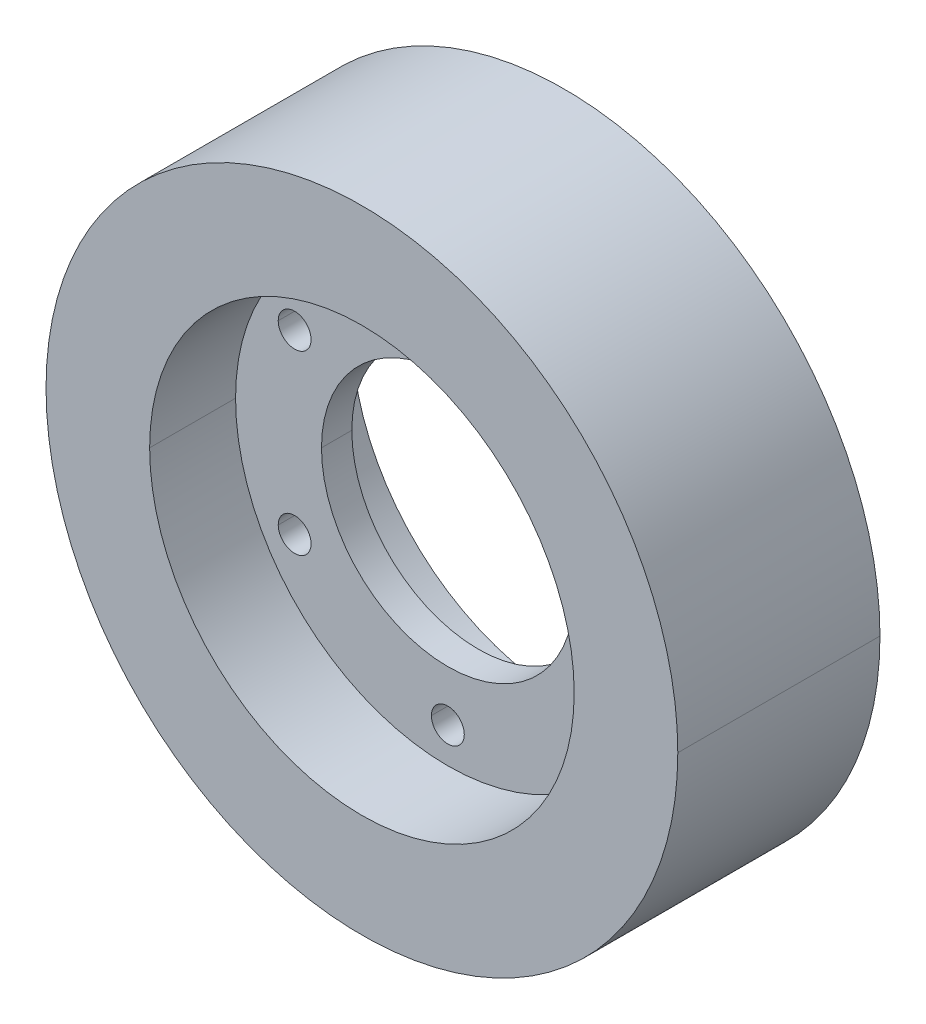
ISO-10303-21;
HEADER;
FILE_DESCRIPTION(('STEP AP214'),'2;1');
FILE_NAME('part.step','',(''),(''),'','','');
FILE_SCHEMA(('AUTOMOTIVE_DESIGN { 1 0 10303 214 1 1 1 1 }'));
ENDSEC;
DATA;
#1=APPLICATION_CONTEXT('core data for automotive mechanical design processes');
#2=APPLICATION_PROTOCOL_DEFINITION('international standard','automotive_design',2000,#1);
#3=PRODUCT_CONTEXT('',#1,'mechanical');
#4=PRODUCT('Part','Part','',(#3));
#5=PRODUCT_RELATED_PRODUCT_CATEGORY('part','',(#4));
#6=PRODUCT_DEFINITION_FORMATION('','',#4);
#7=PRODUCT_DEFINITION_CONTEXT('part definition',#1,'design');
#8=PRODUCT_DEFINITION('design','',#6,#7);
#9=PRODUCT_DEFINITION_SHAPE('','',#8);
#10=(LENGTH_UNIT() NAMED_UNIT(*) SI_UNIT(.MILLI.,.METRE.));
#11=(NAMED_UNIT(*) PLANE_ANGLE_UNIT() SI_UNIT($,.RADIAN.));
#12=(NAMED_UNIT(*) SI_UNIT($,.STERADIAN.) SOLID_ANGLE_UNIT());
#13=UNCERTAINTY_MEASURE_WITH_UNIT(LENGTH_MEASURE(1.E-05),#10,'distance_accuracy_value','');
#14=(GEOMETRIC_REPRESENTATION_CONTEXT(3) GLOBAL_UNCERTAINTY_ASSIGNED_CONTEXT((#13)) GLOBAL_UNIT_ASSIGNED_CONTEXT((#10,
#11,#12)) REPRESENTATION_CONTEXT('',''));
#15=CARTESIAN_POINT('',(0.,0.,0.));
#16=DIRECTION('',(0.,0.,1.));
#17=DIRECTION('',(1.,0.,0.));
#18=AXIS2_PLACEMENT_3D('',#15,#16,#17);
#19=CARTESIAN_POINT('',(0.,0.,23.));
#20=DIRECTION('',(0.,0.,-1.));
#21=DIRECTION('',(-1.,0.,0.));
#22=AXIS2_PLACEMENT_3D('',#19,#20,#21);
#23=CYLINDRICAL_SURFACE('',#22,42.);
#24=CARTESIAN_POINT('',(0.,0.,23.));
#25=DIRECTION('',(0.,0.,1.));
#26=DIRECTION('',(1.,0.,0.));
#27=AXIS2_PLACEMENT_3D('',#24,#25,#26);
#28=CIRCLE('',#27,42.);
#29=CARTESIAN_POINT('',(-42.,0.,23.));
#30=VERTEX_POINT('',#29);
#31=CARTESIAN_POINT('',(42.,0.,23.));
#32=VERTEX_POINT('',#31);
#33=EDGE_CURVE('E11',#30,#32,#28,.T.);
#34=ORIENTED_EDGE('',*,*,#33,.T.);
#35=DIRECTION('',(0.,0.,-1.));
#36=VECTOR('',#35,1.);
#37=CARTESIAN_POINT('',(42.,0.,23.));
#38=LINE('',#37,#36);
#39=CARTESIAN_POINT('',(42.,0.,6.));
#40=VERTEX_POINT('',#39);
#41=EDGE_CURVE('E28',#32,#40,#38,.T.);
#42=ORIENTED_EDGE('',*,*,#41,.T.);
#43=CARTESIAN_POINT('',(0.,0.,6.));
#44=DIRECTION('',(0.,0.,-1.));
#45=DIRECTION('',(1.,0.,0.));
#46=AXIS2_PLACEMENT_3D('',#43,#44,#45);
#47=CIRCLE('',#46,42.);
#48=CARTESIAN_POINT('',(-42.,0.,6.));
#49=VERTEX_POINT('',#48);
#50=EDGE_CURVE('E335',#40,#49,#47,.T.);
#51=ORIENTED_EDGE('',*,*,#50,.T.);
#52=DIRECTION('',(0.,0.,-1.));
#53=VECTOR('',#52,1.);
#54=CARTESIAN_POINT('',(-42.,0.,23.));
#55=LINE('',#54,#53);
#56=EDGE_CURVE('E269',#30,#49,#55,.T.);
#57=ORIENTED_EDGE('',*,*,#56,.F.);
#58=EDGE_LOOP('',(#34,#42,#51,#57));
#59=FACE_BOUND('',#58,.T.);
#60=ADVANCED_FACE('F17',(#59),#23,.F.);
#61=CARTESIAN_POINT('',(0.,0.,23.));
#62=DIRECTION('',(0.,0.,-1.));
#63=DIRECTION('',(-1.,0.,0.));
#64=AXIS2_PLACEMENT_3D('',#61,#62,#63);
#65=CYLINDRICAL_SURFACE('',#64,62.5);
#66=CARTESIAN_POINT('',(0.,0.,23.));
#67=DIRECTION('',(0.,0.,1.));
#68=DIRECTION('',(1.,0.,0.));
#69=AXIS2_PLACEMENT_3D('',#66,#67,#68);
#70=CIRCLE('',#69,62.5);
#71=CARTESIAN_POINT('',(62.5,0.,23.));
#72=VERTEX_POINT('',#71);
#73=CARTESIAN_POINT('',(-62.5,0.,23.));
#74=VERTEX_POINT('',#73);
#75=EDGE_CURVE('E382',#72,#74,#70,.T.);
#76=ORIENTED_EDGE('',*,*,#75,.F.);
#77=DIRECTION('',(0.,0.,-1.));
#78=VECTOR('',#77,1.);
#79=CARTESIAN_POINT('',(62.5,0.,23.));
#80=LINE('',#79,#78);
#81=CARTESIAN_POINT('',(62.5,0.,-17.));
#82=VERTEX_POINT('',#81);
#83=EDGE_CURVE('E246',#72,#82,#80,.T.);
#84=ORIENTED_EDGE('',*,*,#83,.T.);
#85=CARTESIAN_POINT('',(0.,0.,-17.));
#86=DIRECTION('',(0.,0.,1.));
#87=DIRECTION('',(1.,0.,0.));
#88=AXIS2_PLACEMENT_3D('',#85,#86,#87);
#89=CIRCLE('',#88,62.5);
#90=CARTESIAN_POINT('',(-62.5,0.,-17.));
#91=VERTEX_POINT('',#90);
#92=EDGE_CURVE('E242',#82,#91,#89,.T.);
#93=ORIENTED_EDGE('',*,*,#92,.T.);
#94=DIRECTION('',(0.,0.,-1.));
#95=VECTOR('',#94,1.);
#96=CARTESIAN_POINT('',(-62.5,0.,23.));
#97=LINE('',#96,#95);
#98=EDGE_CURVE('E241',#74,#91,#97,.T.);
#99=ORIENTED_EDGE('',*,*,#98,.F.);
#100=EDGE_LOOP('',(#76,#84,#93,#99));
#101=FACE_BOUND('',#100,.T.);
#102=ADVANCED_FACE('F498',(#101),#65,.T.);
#103=CARTESIAN_POINT('',(0.,0.,23.));
#104=DIRECTION('',(0.,0.,-1.));
#105=DIRECTION('',(-1.,0.,0.));
#106=AXIS2_PLACEMENT_3D('',#103,#104,#105);
#107=CYLINDRICAL_SURFACE('',#106,42.);
#108=CARTESIAN_POINT('',(0.,0.,0.));
#109=DIRECTION('',(0.,0.,1.));
#110=DIRECTION('',(1.,0.,0.));
#111=AXIS2_PLACEMENT_3D('',#108,#109,#110);
#112=CIRCLE('',#111,42.);
#113=CARTESIAN_POINT('',(-42.,0.,0.));
#114=VERTEX_POINT('',#113);
#115=CARTESIAN_POINT('',(42.,0.,0.));
#116=VERTEX_POINT('',#115);
#117=EDGE_CURVE('E247',#114,#116,#112,.T.);
#118=ORIENTED_EDGE('',*,*,#117,.T.);
#119=DIRECTION('',(0.,0.,-1.));
#120=VECTOR('',#119,1.);
#121=CARTESIAN_POINT('',(42.,0.,23.));
#122=LINE('',#121,#120);
#123=CARTESIAN_POINT('',(42.,0.,-17.));
#124=VERTEX_POINT('',#123);
#125=EDGE_CURVE('E234',#116,#124,#122,.T.);
#126=ORIENTED_EDGE('',*,*,#125,.T.);
#127=CARTESIAN_POINT('',(0.,0.,-17.));
#128=DIRECTION('',(0.,0.,1.));
#129=DIRECTION('',(1.,0.,0.));
#130=AXIS2_PLACEMENT_3D('',#127,#128,#129);
#131=CIRCLE('',#130,42.);
#132=CARTESIAN_POINT('',(-42.,0.,-17.));
#133=VERTEX_POINT('',#132);
#134=EDGE_CURVE('E240',#133,#124,#131,.T.);
#135=ORIENTED_EDGE('',*,*,#134,.F.);
#136=DIRECTION('',(0.,0.,-1.));
#137=VECTOR('',#136,1.);
#138=CARTESIAN_POINT('',(-42.,0.,23.));
#139=LINE('',#138,#137);
#140=EDGE_CURVE('E399',#114,#133,#139,.T.);
#141=ORIENTED_EDGE('',*,*,#140,.F.);
#142=EDGE_LOOP('',(#118,#126,#135,#141));
#143=FACE_BOUND('',#142,.T.);
#144=ADVANCED_FACE('F518',(#143),#107,.F.);
#145=CARTESIAN_POINT('',(-30.3108891324544,17.4999999999982,6.));
#146=DIRECTION('',(0.,0.,-1.));
#147=DIRECTION('',(-1.,0.,0.));
#148=AXIS2_PLACEMENT_3D('',#145,#146,#147);
#149=CYLINDRICAL_SURFACE('',#148,3.25000000000186);
#150=CARTESIAN_POINT('',(-30.3108891324544,17.4999999999982,6.));
#151=DIRECTION('',(0.,0.,1.));
#152=DIRECTION('',(1.,0.,0.));
#153=AXIS2_PLACEMENT_3D('',#150,#151,#152);
#154=CIRCLE('',#153,3.25000000000186);
#155=CARTESIAN_POINT('',(-33.5608891324563,17.4999999999982,6.));
#156=VERTEX_POINT('',#155);
#157=CARTESIAN_POINT('',(-27.0608891324525,17.4999999999982,6.));
#158=VERTEX_POINT('',#157);
#159=EDGE_CURVE('E231',#156,#158,#154,.T.);
#160=ORIENTED_EDGE('',*,*,#159,.T.);
#161=DIRECTION('',(0.,0.,-1.));
#162=VECTOR('',#161,1.);
#163=CARTESIAN_POINT('',(-27.0608891324525,17.4999999999982,6.));
#164=LINE('',#163,#162);
#165=CARTESIAN_POINT('',(-27.0608891324525,17.4999999999982,0.));
#166=VERTEX_POINT('',#165);
#167=EDGE_CURVE('E235',#158,#166,#164,.T.);
#168=ORIENTED_EDGE('',*,*,#167,.T.);
#169=CARTESIAN_POINT('',(-30.3108891324544,17.4999999999982,0.));
#170=DIRECTION('',(0.,0.,1.));
#171=DIRECTION('',(1.,0.,0.));
#172=AXIS2_PLACEMENT_3D('',#169,#170,#171);
#173=CIRCLE('',#172,3.25000000000186);
#174=CARTESIAN_POINT('',(-33.5608891324563,17.4999999999982,0.));
#175=VERTEX_POINT('',#174);
#176=EDGE_CURVE('E412',#175,#166,#173,.T.);
#177=ORIENTED_EDGE('',*,*,#176,.F.);
#178=DIRECTION('',(0.,0.,-1.));
#179=VECTOR('',#178,1.);
#180=CARTESIAN_POINT('',(-33.5608891324563,17.4999999999982,6.));
#181=LINE('',#180,#179);
#182=EDGE_CURVE('E321',#156,#175,#181,.T.);
#183=ORIENTED_EDGE('',*,*,#182,.F.);
#184=EDGE_LOOP('',(#160,#168,#177,#183));
#185=FACE_BOUND('',#184,.T.);
#186=ADVANCED_FACE('F467',(#185),#149,.F.);
#187=CARTESIAN_POINT('',(-30.3108891324524,-17.5000000000018,6.));
#188=DIRECTION('',(0.,0.,-1.));
#189=DIRECTION('',(-1.,0.,0.));
#190=AXIS2_PLACEMENT_3D('',#187,#188,#189);
#191=CYLINDRICAL_SURFACE('',#190,3.25000000000365);
#192=CARTESIAN_POINT('',(-30.3108891324524,-17.5000000000018,6.));
#193=DIRECTION('',(0.,0.,1.));
#194=DIRECTION('',(1.,0.,0.));
#195=AXIS2_PLACEMENT_3D('',#192,#193,#194);
#196=CIRCLE('',#195,3.25000000000366);
#197=CARTESIAN_POINT('',(-33.560889132456,-17.5000000000018,6.));
#198=VERTEX_POINT('',#197);
#199=CARTESIAN_POINT('',(-27.0608891324487,-17.5000000000018,6.));
#200=VERTEX_POINT('',#199);
#201=EDGE_CURVE('E278',#198,#200,#196,.T.);
#202=ORIENTED_EDGE('',*,*,#201,.T.);
#203=DIRECTION('',(0.,0.,-1.));
#204=VECTOR('',#203,1.);
#205=CARTESIAN_POINT('',(-27.0608891324487,-17.5000000000018,6.));
#206=LINE('',#205,#204);
#207=CARTESIAN_POINT('',(-27.0608891324487,-17.5000000000018,0.));
#208=VERTEX_POINT('',#207);
#209=EDGE_CURVE('E281',#200,#208,#206,.T.);
#210=ORIENTED_EDGE('',*,*,#209,.T.);
#211=CARTESIAN_POINT('',(-30.3108891324524,-17.5000000000018,0.));
#212=DIRECTION('',(0.,0.,1.));
#213=DIRECTION('',(1.,0.,0.));
#214=AXIS2_PLACEMENT_3D('',#211,#212,#213);
#215=CIRCLE('',#214,3.25000000000366);
#216=CARTESIAN_POINT('',(-33.560889132456,-17.5000000000018,0.));
#217=VERTEX_POINT('',#216);
#218=EDGE_CURVE('E250',#217,#208,#215,.T.);
#219=ORIENTED_EDGE('',*,*,#218,.F.);
#220=DIRECTION('',(0.,0.,-1.));
#221=VECTOR('',#220,1.);
#222=CARTESIAN_POINT('',(-33.560889132456,-17.5000000000018,6.));
#223=LINE('',#222,#221);
#224=EDGE_CURVE('E277',#198,#217,#223,.T.);
#225=ORIENTED_EDGE('',*,*,#224,.F.);
#226=EDGE_LOOP('',(#202,#210,#219,#225));
#227=FACE_BOUND('',#226,.T.);
#228=ADVANCED_FACE('F530',(#227),#191,.F.);
#229=CARTESIAN_POINT('',(3.96618052886552E-12,-35.,6.));
#230=DIRECTION('',(0.,0.,-1.));
#231=DIRECTION('',(-1.,0.,0.));
#232=AXIS2_PLACEMENT_3D('',#229,#230,#231);
#233=CYLINDRICAL_SURFACE('',#232,3.25000000000403);
#234=CARTESIAN_POINT('',(3.96618052886552E-12,-35.,6.));
#235=DIRECTION('',(0.,0.,1.));
#236=DIRECTION('',(1.,0.,0.));
#237=AXIS2_PLACEMENT_3D('',#234,#235,#236);
#238=CIRCLE('',#237,3.25000000000403);
#239=CARTESIAN_POINT('',(-3.25000000000006,-35.,6.));
#240=VERTEX_POINT('',#239);
#241=CARTESIAN_POINT('',(3.25000000000799,-35.,6.));
#242=VERTEX_POINT('',#241);
#243=EDGE_CURVE('E341',#240,#242,#238,.T.);
#244=ORIENTED_EDGE('',*,*,#243,.T.);
#245=DIRECTION('',(0.,0.,-1.));
#246=VECTOR('',#245,1.);
#247=CARTESIAN_POINT('',(3.25000000000799,-35.,6.));
#248=LINE('',#247,#246);
#249=CARTESIAN_POINT('',(3.25000000000799,-35.,0.));
#250=VERTEX_POINT('',#249);
#251=EDGE_CURVE('E344',#242,#250,#248,.T.);
#252=ORIENTED_EDGE('',*,*,#251,.T.);
#253=CARTESIAN_POINT('',(3.96618052886552E-12,-35.,0.));
#254=DIRECTION('',(0.,0.,1.));
#255=DIRECTION('',(1.,0.,0.));
#256=AXIS2_PLACEMENT_3D('',#253,#254,#255);
#257=CIRCLE('',#256,3.25000000000403);
#258=CARTESIAN_POINT('',(-3.25000000000006,-35.,0.));
#259=VERTEX_POINT('',#258);
#260=EDGE_CURVE('E124',#259,#250,#257,.T.);
#261=ORIENTED_EDGE('',*,*,#260,.F.);
#262=DIRECTION('',(0.,0.,-1.));
#263=VECTOR('',#262,1.);
#264=CARTESIAN_POINT('',(-3.25000000000006,-35.,6.));
#265=LINE('',#264,#263);
#266=EDGE_CURVE('E140',#240,#259,#265,.T.);
#267=ORIENTED_EDGE('',*,*,#266,.F.);
#268=EDGE_LOOP('',(#244,#252,#261,#267));
#269=FACE_BOUND('',#268,.T.);
#270=ADVANCED_FACE('F526',(#269),#233,.F.);
#271=CARTESIAN_POINT('',(30.3108891324583,-17.4999999999983,6.));
#272=DIRECTION('',(0.,0.,-1.));
#273=DIRECTION('',(-1.,0.,0.));
#274=AXIS2_PLACEMENT_3D('',#271,#272,#273);
#275=CYLINDRICAL_SURFACE('',#274,3.25000000000251);
#276=CARTESIAN_POINT('',(30.3108891324583,-17.4999999999983,6.));
#277=DIRECTION('',(0.,0.,1.));
#278=DIRECTION('',(1.,0.,0.));
#279=AXIS2_PLACEMENT_3D('',#276,#277,#278);
#280=CIRCLE('',#279,3.25000000000251);
#281=CARTESIAN_POINT('',(27.0608891324558,-17.4999999999983,6.));
#282=VERTEX_POINT('',#281);
#283=CARTESIAN_POINT('',(33.5608891324609,-17.4999999999983,6.));
#284=VERTEX_POINT('',#283);
#285=EDGE_CURVE('E421',#282,#284,#280,.T.);
#286=ORIENTED_EDGE('',*,*,#285,.T.);
#287=DIRECTION('',(0.,0.,-1.));
#288=VECTOR('',#287,1.);
#289=CARTESIAN_POINT('',(33.5608891324609,-17.4999999999983,6.));
#290=LINE('',#289,#288);
#291=CARTESIAN_POINT('',(33.5608891324609,-17.4999999999983,0.));
#292=VERTEX_POINT('',#291);
#293=EDGE_CURVE('E210',#284,#292,#290,.T.);
#294=ORIENTED_EDGE('',*,*,#293,.T.);
#295=CARTESIAN_POINT('',(30.3108891324583,-17.4999999999983,0.));
#296=DIRECTION('',(0.,0.,1.));
#297=DIRECTION('',(1.,0.,0.));
#298=AXIS2_PLACEMENT_3D('',#295,#296,#297);
#299=CIRCLE('',#298,3.25000000000251);
#300=CARTESIAN_POINT('',(27.0608891324558,-17.4999999999983,0.));
#301=VERTEX_POINT('',#300);
#302=EDGE_CURVE('E312',#301,#292,#299,.T.);
#303=ORIENTED_EDGE('',*,*,#302,.F.);
#304=DIRECTION('',(0.,0.,-1.));
#305=VECTOR('',#304,1.);
#306=CARTESIAN_POINT('',(27.0608891324558,-17.4999999999983,6.));
#307=LINE('',#306,#305);
#308=EDGE_CURVE('E229',#282,#301,#307,.T.);
#309=ORIENTED_EDGE('',*,*,#308,.F.);
#310=EDGE_LOOP('',(#286,#294,#303,#309));
#311=FACE_BOUND('',#310,.T.);
#312=ADVANCED_FACE('F529',(#311),#275,.F.);
#313=CARTESIAN_POINT('',(30.3108891324563,17.5000000000018,6.));
#314=DIRECTION('',(0.,0.,-1.));
#315=DIRECTION('',(-1.,0.,0.));
#316=AXIS2_PLACEMENT_3D('',#313,#314,#315);
#317=CYLINDRICAL_SURFACE('',#316,3.25000000000053);
#318=CARTESIAN_POINT('',(30.3108891324563,17.5000000000018,6.));
#319=DIRECTION('',(0.,0.,1.));
#320=DIRECTION('',(1.,0.,0.));
#321=AXIS2_PLACEMENT_3D('',#318,#319,#320);
#322=CIRCLE('',#321,3.25000000000053);
#323=CARTESIAN_POINT('',(27.0608891324558,17.5000000000018,6.));
#324=VERTEX_POINT('',#323);
#325=CARTESIAN_POINT('',(33.5608891324569,17.5000000000018,6.));
#326=VERTEX_POINT('',#325);
#327=EDGE_CURVE('E202',#324,#326,#322,.T.);
#328=ORIENTED_EDGE('',*,*,#327,.T.);
#329=DIRECTION('',(0.,0.,-1.));
#330=VECTOR('',#329,1.);
#331=CARTESIAN_POINT('',(33.5608891324569,17.5000000000018,6.));
#332=LINE('',#331,#330);
#333=CARTESIAN_POINT('',(33.5608891324569,17.5000000000018,0.));
#334=VERTEX_POINT('',#333);
#335=EDGE_CURVE('E191',#326,#334,#332,.T.);
#336=ORIENTED_EDGE('',*,*,#335,.T.);
#337=CARTESIAN_POINT('',(30.3108891324563,17.5000000000018,0.));
#338=DIRECTION('',(0.,0.,1.));
#339=DIRECTION('',(1.,0.,0.));
#340=AXIS2_PLACEMENT_3D('',#337,#338,#339);
#341=CIRCLE('',#340,3.25000000000053);
#342=CARTESIAN_POINT('',(27.0608891324558,17.5000000000018,0.));
#343=VERTEX_POINT('',#342);
#344=EDGE_CURVE('E348',#343,#334,#341,.T.);
#345=ORIENTED_EDGE('',*,*,#344,.F.);
#346=DIRECTION('',(0.,0.,-1.));
#347=VECTOR('',#346,1.);
#348=CARTESIAN_POINT('',(27.0608891324558,17.5000000000018,6.));
#349=LINE('',#348,#347);
#350=EDGE_CURVE('E207',#324,#343,#349,.T.);
#351=ORIENTED_EDGE('',*,*,#350,.F.);
#352=EDGE_LOOP('',(#328,#336,#345,#351));
#353=FACE_BOUND('',#352,.T.);
#354=ADVANCED_FACE('F206',(#353),#317,.F.);
#355=CARTESIAN_POINT('',(0.,35.,6.));
#356=DIRECTION('',(0.,0.,-1.));
#357=DIRECTION('',(-1.,0.,0.));
#358=AXIS2_PLACEMENT_3D('',#355,#356,#357);
#359=CYLINDRICAL_SURFACE('',#358,3.25);
#360=CARTESIAN_POINT('',(0.,35.,6.));
#361=DIRECTION('',(0.,0.,1.));
#362=DIRECTION('',(1.,0.,0.));
#363=AXIS2_PLACEMENT_3D('',#360,#361,#362);
#364=CIRCLE('',#363,3.25);
#365=CARTESIAN_POINT('',(-3.25,35.,6.));
#366=VERTEX_POINT('',#365);
#367=CARTESIAN_POINT('',(3.25,35.,6.));
#368=VERTEX_POINT('',#367);
#369=EDGE_CURVE('E203',#366,#368,#364,.T.);
#370=ORIENTED_EDGE('',*,*,#369,.T.);
#371=DIRECTION('',(0.,0.,-1.));
#372=VECTOR('',#371,1.);
#373=CARTESIAN_POINT('',(3.25,35.,6.));
#374=LINE('',#373,#372);
#375=CARTESIAN_POINT('',(3.25,35.,0.));
#376=VERTEX_POINT('',#375);
#377=EDGE_CURVE('E294',#368,#376,#374,.T.);
#378=ORIENTED_EDGE('',*,*,#377,.T.);
#379=CARTESIAN_POINT('',(0.,35.,0.));
#380=DIRECTION('',(0.,0.,1.));
#381=DIRECTION('',(1.,0.,0.));
#382=AXIS2_PLACEMENT_3D('',#379,#380,#381);
#383=CIRCLE('',#382,3.25);
#384=CARTESIAN_POINT('',(-3.25,35.,0.));
#385=VERTEX_POINT('',#384);
#386=EDGE_CURVE('E305',#385,#376,#383,.T.);
#387=ORIENTED_EDGE('',*,*,#386,.F.);
#388=DIRECTION('',(0.,0.,-1.));
#389=VECTOR('',#388,1.);
#390=CARTESIAN_POINT('',(-3.25,35.,6.));
#391=LINE('',#390,#389);
#392=EDGE_CURVE('E215',#366,#385,#391,.T.);
#393=ORIENTED_EDGE('',*,*,#392,.F.);
#394=EDGE_LOOP('',(#370,#378,#387,#393));
#395=FACE_BOUND('',#394,.T.);
#396=ADVANCED_FACE('F553',(#395),#359,.F.);
#397=CARTESIAN_POINT('',(0.,0.,6.));
#398=DIRECTION('',(0.,0.,-1.));
#399=DIRECTION('',(-1.,0.,0.));
#400=AXIS2_PLACEMENT_3D('',#397,#398,#399);
#401=CYLINDRICAL_SURFACE('',#400,25.);
#402=CARTESIAN_POINT('',(0.,0.,6.));
#403=DIRECTION('',(0.,0.,1.));
#404=DIRECTION('',(1.,0.,0.));
#405=AXIS2_PLACEMENT_3D('',#402,#403,#404);
#406=CIRCLE('',#405,25.);
#407=CARTESIAN_POINT('',(-25.,0.,6.));
#408=VERTEX_POINT('',#407);
#409=CARTESIAN_POINT('',(25.,0.,6.));
#410=VERTEX_POINT('',#409);
#411=EDGE_CURVE('E285',#408,#410,#406,.T.);
#412=ORIENTED_EDGE('',*,*,#411,.T.);
#413=DIRECTION('',(0.,0.,-1.));
#414=VECTOR('',#413,1.);
#415=CARTESIAN_POINT('',(25.,0.,6.));
#416=LINE('',#415,#414);
#417=CARTESIAN_POINT('',(25.,0.,0.));
#418=VERTEX_POINT('',#417);
#419=EDGE_CURVE('E282',#410,#418,#416,.T.);
#420=ORIENTED_EDGE('',*,*,#419,.T.);
#421=CARTESIAN_POINT('',(0.,0.,0.));
#422=DIRECTION('',(0.,0.,1.));
#423=DIRECTION('',(1.,0.,0.));
#424=AXIS2_PLACEMENT_3D('',#421,#422,#423);
#425=CIRCLE('',#424,25.);
#426=CARTESIAN_POINT('',(-25.,0.,0.));
#427=VERTEX_POINT('',#426);
#428=EDGE_CURVE('E286',#427,#418,#425,.T.);
#429=ORIENTED_EDGE('',*,*,#428,.F.);
#430=DIRECTION('',(0.,0.,-1.));
#431=VECTOR('',#430,1.);
#432=CARTESIAN_POINT('',(-25.,0.,6.));
#433=LINE('',#432,#431);
#434=EDGE_CURVE('E316',#408,#427,#433,.T.);
#435=ORIENTED_EDGE('',*,*,#434,.F.);
#436=EDGE_LOOP('',(#412,#420,#429,#435));
#437=FACE_BOUND('',#436,.T.);
#438=ADVANCED_FACE('F438',(#437),#401,.F.);
#439=CARTESIAN_POINT('',(0.,0.,6.));
#440=DIRECTION('',(0.,0.,1.));
#441=DIRECTION('',(1.,0.,0.));
#442=AXIS2_PLACEMENT_3D('',#439,#440,#441);
#443=PLANE('',#442);
#444=CARTESIAN_POINT('',(0.,0.,6.));
#445=DIRECTION('',(0.,0.,-1.));
#446=DIRECTION('',(1.,0.,0.));
#447=AXIS2_PLACEMENT_3D('',#444,#445,#446);
#448=CIRCLE('',#447,42.);
#449=EDGE_CURVE('E338',#49,#40,#448,.T.);
#450=ORIENTED_EDGE('',*,*,#449,.F.);
#451=ORIENTED_EDGE('',*,*,#50,.F.);
#452=EDGE_LOOP('',(#450,#451));
#453=FACE_BOUND('',#452,.T.);
#454=ORIENTED_EDGE('',*,*,#201,.F.);
#455=CARTESIAN_POINT('',(-30.3108891324524,-17.5000000000018,6.));
#456=DIRECTION('',(0.,0.,1.));
#457=DIRECTION('',(1.,0.,0.));
#458=AXIS2_PLACEMENT_3D('',#455,#456,#457);
#459=CIRCLE('',#458,3.25000000000366);
#460=EDGE_CURVE('E273',#200,#198,#459,.T.);
#461=ORIENTED_EDGE('',*,*,#460,.F.);
#462=EDGE_LOOP('',(#454,#461));
#463=FACE_BOUND('',#462,.T.);
#464=ORIENTED_EDGE('',*,*,#285,.F.);
#465=CARTESIAN_POINT('',(30.3108891324583,-17.4999999999983,6.));
#466=DIRECTION('',(0.,0.,1.));
#467=DIRECTION('',(1.,0.,0.));
#468=AXIS2_PLACEMENT_3D('',#465,#466,#467);
#469=CIRCLE('',#468,3.25000000000251);
#470=EDGE_CURVE('E225',#284,#282,#469,.T.);
#471=ORIENTED_EDGE('',*,*,#470,.F.);
#472=EDGE_LOOP('',(#464,#471));
#473=FACE_BOUND('',#472,.T.);
#474=ORIENTED_EDGE('',*,*,#369,.F.);
#475=CARTESIAN_POINT('',(0.,35.,6.));
#476=DIRECTION('',(0.,0.,1.));
#477=DIRECTION('',(1.,0.,0.));
#478=AXIS2_PLACEMENT_3D('',#475,#476,#477);
#479=CIRCLE('',#478,3.25);
#480=EDGE_CURVE('E222',#368,#366,#479,.T.);
#481=ORIENTED_EDGE('',*,*,#480,.F.);
#482=EDGE_LOOP('',(#474,#481));
#483=FACE_BOUND('',#482,.T.);
#484=ORIENTED_EDGE('',*,*,#411,.F.);
#485=CARTESIAN_POINT('',(0.,0.,6.));
#486=DIRECTION('',(0.,0.,1.));
#487=DIRECTION('',(1.,0.,0.));
#488=AXIS2_PLACEMENT_3D('',#485,#486,#487);
#489=CIRCLE('',#488,25.);
#490=EDGE_CURVE('E328',#410,#408,#489,.T.);
#491=ORIENTED_EDGE('',*,*,#490,.F.);
#492=EDGE_LOOP('',(#484,#491));
#493=FACE_BOUND('',#492,.T.);
#494=ORIENTED_EDGE('',*,*,#327,.F.);
#495=CARTESIAN_POINT('',(30.3108891324563,17.5000000000018,6.));
#496=DIRECTION('',(0.,0.,1.));
#497=DIRECTION('',(1.,0.,0.));
#498=AXIS2_PLACEMENT_3D('',#495,#496,#497);
#499=CIRCLE('',#498,3.25000000000053);
#500=EDGE_CURVE('E196',#326,#324,#499,.T.);
#501=ORIENTED_EDGE('',*,*,#500,.F.);
#502=EDGE_LOOP('',(#494,#501));
#503=FACE_BOUND('',#502,.T.);
#504=ORIENTED_EDGE('',*,*,#243,.F.);
#505=CARTESIAN_POINT('',(3.96618052886552E-12,-35.,6.));
#506=DIRECTION('',(0.,0.,1.));
#507=DIRECTION('',(1.,0.,0.));
#508=AXIS2_PLACEMENT_3D('',#505,#506,#507);
#509=CIRCLE('',#508,3.25000000000403);
#510=EDGE_CURVE('E395',#242,#240,#509,.T.);
#511=ORIENTED_EDGE('',*,*,#510,.F.);
#512=EDGE_LOOP('',(#504,#511));
#513=FACE_BOUND('',#512,.T.);
#514=ORIENTED_EDGE('',*,*,#159,.F.);
#515=CARTESIAN_POINT('',(-30.3108891324544,17.4999999999982,6.));
#516=DIRECTION('',(0.,0.,1.));
#517=DIRECTION('',(1.,0.,0.));
#518=AXIS2_PLACEMENT_3D('',#515,#516,#517);
#519=CIRCLE('',#518,3.25000000000186);
#520=EDGE_CURVE('E320',#158,#156,#519,.T.);
#521=ORIENTED_EDGE('',*,*,#520,.F.);
#522=EDGE_LOOP('',(#514,#521));
#523=FACE_BOUND('',#522,.T.);
#524=ADVANCED_FACE('F212',(#453,#463,#473,#483,#493,#503,#513,#523),#443,.T.);
#525=CARTESIAN_POINT('',(0.,0.,0.));
#526=DIRECTION('',(0.,0.,1.));
#527=DIRECTION('',(1.,0.,0.));
#528=AXIS2_PLACEMENT_3D('',#525,#526,#527);
#529=PLANE('',#528);
#530=ORIENTED_EDGE('',*,*,#117,.F.);
#531=CARTESIAN_POINT('',(0.,0.,0.));
#532=DIRECTION('',(0.,0.,1.));
#533=DIRECTION('',(1.,0.,0.));
#534=AXIS2_PLACEMENT_3D('',#531,#532,#533);
#535=CIRCLE('',#534,42.);
#536=EDGE_CURVE('E324',#116,#114,#535,.T.);
#537=ORIENTED_EDGE('',*,*,#536,.F.);
#538=EDGE_LOOP('',(#530,#537));
#539=FACE_BOUND('',#538,.T.);
#540=ORIENTED_EDGE('',*,*,#428,.T.);
#541=CARTESIAN_POINT('',(0.,0.,0.));
#542=DIRECTION('',(0.,0.,1.));
#543=DIRECTION('',(1.,0.,0.));
#544=AXIS2_PLACEMENT_3D('',#541,#542,#543);
#545=CIRCLE('',#544,25.);
#546=EDGE_CURVE('E297',#418,#427,#545,.T.);
#547=ORIENTED_EDGE('',*,*,#546,.T.);
#548=EDGE_LOOP('',(#540,#547));
#549=FACE_BOUND('',#548,.T.);
#550=ORIENTED_EDGE('',*,*,#386,.T.);
#551=CARTESIAN_POINT('',(0.,35.,0.));
#552=DIRECTION('',(0.,0.,1.));
#553=DIRECTION('',(1.,0.,0.));
#554=AXIS2_PLACEMENT_3D('',#551,#552,#553);
#555=CIRCLE('',#554,3.25);
#556=EDGE_CURVE('E345',#376,#385,#555,.T.);
#557=ORIENTED_EDGE('',*,*,#556,.T.);
#558=EDGE_LOOP('',(#550,#557));
#559=FACE_BOUND('',#558,.T.);
#560=ORIENTED_EDGE('',*,*,#344,.T.);
#561=CARTESIAN_POINT('',(30.3108891324563,17.5000000000018,0.));
#562=DIRECTION('',(0.,0.,1.));
#563=DIRECTION('',(1.,0.,0.));
#564=AXIS2_PLACEMENT_3D('',#561,#562,#563);
#565=CIRCLE('',#564,3.25000000000053);
#566=EDGE_CURVE('E198',#334,#343,#565,.T.);
#567=ORIENTED_EDGE('',*,*,#566,.T.);
#568=EDGE_LOOP('',(#560,#567));
#569=FACE_BOUND('',#568,.T.);
#570=ORIENTED_EDGE('',*,*,#302,.T.);
#571=CARTESIAN_POINT('',(30.3108891324583,-17.4999999999983,0.));
#572=DIRECTION('',(0.,0.,1.));
#573=DIRECTION('',(1.,0.,0.));
#574=AXIS2_PLACEMENT_3D('',#571,#572,#573);
#575=CIRCLE('',#574,3.25000000000251);
#576=EDGE_CURVE('E309',#292,#301,#575,.T.);
#577=ORIENTED_EDGE('',*,*,#576,.T.);
#578=EDGE_LOOP('',(#570,#577));
#579=FACE_BOUND('',#578,.T.);
#580=ORIENTED_EDGE('',*,*,#260,.T.);
#581=CARTESIAN_POINT('',(3.96618052886552E-12,-35.,0.));
#582=DIRECTION('',(0.,0.,1.));
#583=DIRECTION('',(1.,0.,0.));
#584=AXIS2_PLACEMENT_3D('',#581,#582,#583);
#585=CIRCLE('',#584,3.25000000000403);
#586=EDGE_CURVE('E248',#250,#259,#585,.T.);
#587=ORIENTED_EDGE('',*,*,#586,.T.);
#588=EDGE_LOOP('',(#580,#587));
#589=FACE_BOUND('',#588,.T.);
#590=ORIENTED_EDGE('',*,*,#218,.T.);
#591=CARTESIAN_POINT('',(-30.3108891324524,-17.5000000000018,0.));
#592=DIRECTION('',(0.,0.,1.));
#593=DIRECTION('',(1.,0.,0.));
#594=AXIS2_PLACEMENT_3D('',#591,#592,#593);
#595=CIRCLE('',#594,3.25000000000366);
#596=EDGE_CURVE('E21',#208,#217,#595,.T.);
#597=ORIENTED_EDGE('',*,*,#596,.T.);
#598=EDGE_LOOP('',(#590,#597));
#599=FACE_BOUND('',#598,.T.);
#600=ORIENTED_EDGE('',*,*,#176,.T.);
#601=CARTESIAN_POINT('',(-30.3108891324544,17.4999999999982,0.));
#602=DIRECTION('',(0.,0.,1.));
#603=DIRECTION('',(1.,0.,0.));
#604=AXIS2_PLACEMENT_3D('',#601,#602,#603);
#605=CIRCLE('',#604,3.25000000000186);
#606=EDGE_CURVE('E332',#166,#175,#605,.T.);
#607=ORIENTED_EDGE('',*,*,#606,.T.);
#608=EDGE_LOOP('',(#600,#607));
#609=FACE_BOUND('',#608,.T.);
#610=ADVANCED_FACE('F437',(#539,#549,#559,#569,#579,#589,#599,#609),#529,.F.);
#611=CARTESIAN_POINT('',(0.,0.,6.));
#612=DIRECTION('',(0.,0.,-1.));
#613=DIRECTION('',(-1.,0.,0.));
#614=AXIS2_PLACEMENT_3D('',#611,#612,#613);
#615=CYLINDRICAL_SURFACE('',#614,25.);
#616=ORIENTED_EDGE('',*,*,#419,.F.);
#617=ORIENTED_EDGE('',*,*,#490,.T.);
#618=ORIENTED_EDGE('',*,*,#434,.T.);
#619=ORIENTED_EDGE('',*,*,#546,.F.);
#620=EDGE_LOOP('',(#616,#617,#618,#619));
#621=FACE_BOUND('',#620,.T.);
#622=ADVANCED_FACE('F452',(#621),#615,.F.);
#623=CARTESIAN_POINT('',(0.,35.,6.));
#624=DIRECTION('',(0.,0.,-1.));
#625=DIRECTION('',(-1.,0.,0.));
#626=AXIS2_PLACEMENT_3D('',#623,#624,#625);
#627=CYLINDRICAL_SURFACE('',#626,3.25);
#628=ORIENTED_EDGE('',*,*,#377,.F.);
#629=ORIENTED_EDGE('',*,*,#480,.T.);
#630=ORIENTED_EDGE('',*,*,#392,.T.);
#631=ORIENTED_EDGE('',*,*,#556,.F.);
#632=EDGE_LOOP('',(#628,#629,#630,#631));
#633=FACE_BOUND('',#632,.T.);
#634=ADVANCED_FACE('F525',(#633),#627,.F.);
#635=CARTESIAN_POINT('',(30.3108891324563,17.5000000000018,6.));
#636=DIRECTION('',(0.,0.,-1.));
#637=DIRECTION('',(-1.,0.,0.));
#638=AXIS2_PLACEMENT_3D('',#635,#636,#637);
#639=CYLINDRICAL_SURFACE('',#638,3.25000000000053);
#640=ORIENTED_EDGE('',*,*,#335,.F.);
#641=ORIENTED_EDGE('',*,*,#500,.T.);
#642=ORIENTED_EDGE('',*,*,#350,.T.);
#643=ORIENTED_EDGE('',*,*,#566,.F.);
#644=EDGE_LOOP('',(#640,#641,#642,#643));
#645=FACE_BOUND('',#644,.T.);
#646=ADVANCED_FACE('F193',(#645),#639,.F.);
#647=CARTESIAN_POINT('',(30.3108891324583,-17.4999999999983,6.));
#648=DIRECTION('',(0.,0.,-1.));
#649=DIRECTION('',(-1.,0.,0.));
#650=AXIS2_PLACEMENT_3D('',#647,#648,#649);
#651=CYLINDRICAL_SURFACE('',#650,3.25000000000251);
#652=ORIENTED_EDGE('',*,*,#293,.F.);
#653=ORIENTED_EDGE('',*,*,#470,.T.);
#654=ORIENTED_EDGE('',*,*,#308,.T.);
#655=ORIENTED_EDGE('',*,*,#576,.F.);
#656=EDGE_LOOP('',(#652,#653,#654,#655));
#657=FACE_BOUND('',#656,.T.);
#658=ADVANCED_FACE('F566',(#657),#651,.F.);
#659=CARTESIAN_POINT('',(3.96618052886552E-12,-35.,6.));
#660=DIRECTION('',(0.,0.,-1.));
#661=DIRECTION('',(-1.,0.,0.));
#662=AXIS2_PLACEMENT_3D('',#659,#660,#661);
#663=CYLINDRICAL_SURFACE('',#662,3.25000000000403);
#664=ORIENTED_EDGE('',*,*,#251,.F.);
#665=ORIENTED_EDGE('',*,*,#510,.T.);
#666=ORIENTED_EDGE('',*,*,#266,.T.);
#667=ORIENTED_EDGE('',*,*,#586,.F.);
#668=EDGE_LOOP('',(#664,#665,#666,#667));
#669=FACE_BOUND('',#668,.T.);
#670=ADVANCED_FACE('F545',(#669),#663,.F.);
#671=CARTESIAN_POINT('',(-30.3108891324524,-17.5000000000018,6.));
#672=DIRECTION('',(0.,0.,-1.));
#673=DIRECTION('',(-1.,0.,0.));
#674=AXIS2_PLACEMENT_3D('',#671,#672,#673);
#675=CYLINDRICAL_SURFACE('',#674,3.25000000000365);
#676=ORIENTED_EDGE('',*,*,#209,.F.);
#677=ORIENTED_EDGE('',*,*,#460,.T.);
#678=ORIENTED_EDGE('',*,*,#224,.T.);
#679=ORIENTED_EDGE('',*,*,#596,.F.);
#680=EDGE_LOOP('',(#676,#677,#678,#679));
#681=FACE_BOUND('',#680,.T.);
#682=ADVANCED_FACE('F543',(#681),#675,.F.);
#683=CARTESIAN_POINT('',(-30.3108891324544,17.4999999999982,6.));
#684=DIRECTION('',(0.,0.,-1.));
#685=DIRECTION('',(-1.,0.,0.));
#686=AXIS2_PLACEMENT_3D('',#683,#684,#685);
#687=CYLINDRICAL_SURFACE('',#686,3.25000000000186);
#688=ORIENTED_EDGE('',*,*,#167,.F.);
#689=ORIENTED_EDGE('',*,*,#520,.T.);
#690=ORIENTED_EDGE('',*,*,#182,.T.);
#691=ORIENTED_EDGE('',*,*,#606,.F.);
#692=EDGE_LOOP('',(#688,#689,#690,#691));
#693=FACE_BOUND('',#692,.T.);
#694=ADVANCED_FACE('F471',(#693),#687,.F.);
#695=CARTESIAN_POINT('',(0.,0.,23.));
#696=DIRECTION('',(0.,0.,-1.));
#697=DIRECTION('',(-1.,0.,0.));
#698=AXIS2_PLACEMENT_3D('',#695,#696,#697);
#699=CYLINDRICAL_SURFACE('',#698,42.);
#700=ORIENTED_EDGE('',*,*,#125,.F.);
#701=ORIENTED_EDGE('',*,*,#536,.T.);
#702=ORIENTED_EDGE('',*,*,#140,.T.);
#703=CARTESIAN_POINT('',(0.,0.,-17.));
#704=DIRECTION('',(0.,0.,1.));
#705=DIRECTION('',(1.,0.,0.));
#706=AXIS2_PLACEMENT_3D('',#703,#704,#705);
#707=CIRCLE('',#706,42.);
#708=EDGE_CURVE('E236',#124,#133,#707,.T.);
#709=ORIENTED_EDGE('',*,*,#708,.F.);
#710=EDGE_LOOP('',(#700,#701,#702,#709));
#711=FACE_BOUND('',#710,.T.);
#712=ADVANCED_FACE('F504',(#711),#699,.F.);
#713=CARTESIAN_POINT('',(0.,0.,23.));
#714=DIRECTION('',(0.,0.,1.));
#715=DIRECTION('',(1.,0.,0.));
#716=AXIS2_PLACEMENT_3D('',#713,#714,#715);
#717=PLANE('',#716);
#718=CARTESIAN_POINT('',(0.,0.,23.));
#719=DIRECTION('',(0.,0.,1.));
#720=DIRECTION('',(1.,0.,0.));
#721=AXIS2_PLACEMENT_3D('',#718,#719,#720);
#722=CIRCLE('',#721,62.5);
#723=EDGE_CURVE('E386',#74,#72,#722,.T.);
#724=ORIENTED_EDGE('',*,*,#723,.T.);
#725=ORIENTED_EDGE('',*,*,#75,.T.);
#726=EDGE_LOOP('',(#724,#725));
#727=FACE_BOUND('',#726,.T.);
#728=ORIENTED_EDGE('',*,*,#33,.F.);
#729=CARTESIAN_POINT('',(0.,0.,23.));
#730=DIRECTION('',(0.,0.,1.));
#731=DIRECTION('',(1.,0.,0.));
#732=AXIS2_PLACEMENT_3D('',#729,#730,#731);
#733=CIRCLE('',#732,42.);
#734=EDGE_CURVE('E262',#32,#30,#733,.T.);
#735=ORIENTED_EDGE('',*,*,#734,.F.);
#736=EDGE_LOOP('',(#728,#735));
#737=FACE_BOUND('',#736,.T.);
#738=ADVANCED_FACE('F19',(#727,#737),#717,.T.);
#739=CARTESIAN_POINT('',(0.,0.,-17.));
#740=DIRECTION('',(0.,0.,1.));
#741=DIRECTION('',(1.,0.,0.));
#742=AXIS2_PLACEMENT_3D('',#739,#740,#741);
#743=PLANE('',#742);
#744=CARTESIAN_POINT('',(0.,0.,-17.));
#745=DIRECTION('',(0.,0.,1.));
#746=DIRECTION('',(1.,0.,0.));
#747=AXIS2_PLACEMENT_3D('',#744,#745,#746);
#748=CIRCLE('',#747,62.5);
#749=EDGE_CURVE('E253',#91,#82,#748,.T.);
#750=ORIENTED_EDGE('',*,*,#749,.F.);
#751=ORIENTED_EDGE('',*,*,#92,.F.);
#752=EDGE_LOOP('',(#750,#751));
#753=FACE_BOUND('',#752,.T.);
#754=ORIENTED_EDGE('',*,*,#134,.T.);
#755=ORIENTED_EDGE('',*,*,#708,.T.);
#756=EDGE_LOOP('',(#754,#755));
#757=FACE_BOUND('',#756,.T.);
#758=ADVANCED_FACE('F503',(#753,#757),#743,.F.);
#759=CARTESIAN_POINT('',(0.,0.,23.));
#760=DIRECTION('',(0.,0.,-1.));
#761=DIRECTION('',(-1.,0.,0.));
#762=AXIS2_PLACEMENT_3D('',#759,#760,#761);
#763=CYLINDRICAL_SURFACE('',#762,62.5);
#764=ORIENTED_EDGE('',*,*,#83,.F.);
#765=ORIENTED_EDGE('',*,*,#723,.F.);
#766=ORIENTED_EDGE('',*,*,#98,.T.);
#767=ORIENTED_EDGE('',*,*,#749,.T.);
#768=EDGE_LOOP('',(#764,#765,#766,#767));
#769=FACE_BOUND('',#768,.T.);
#770=ADVANCED_FACE('F500',(#769),#763,.T.);
#771=CARTESIAN_POINT('',(0.,0.,23.));
#772=DIRECTION('',(0.,0.,-1.));
#773=DIRECTION('',(-1.,0.,0.));
#774=AXIS2_PLACEMENT_3D('',#771,#772,#773);
#775=CYLINDRICAL_SURFACE('',#774,42.);
#776=ORIENTED_EDGE('',*,*,#41,.F.);
#777=ORIENTED_EDGE('',*,*,#734,.T.);
#778=ORIENTED_EDGE('',*,*,#56,.T.);
#779=ORIENTED_EDGE('',*,*,#449,.T.);
#780=EDGE_LOOP('',(#776,#777,#778,#779));
#781=FACE_BOUND('',#780,.T.);
#782=ADVANCED_FACE('F429',(#781),#775,.F.);
#783=CLOSED_SHELL('',(#60,#102,#144,#186,#228,#270,#312,#354,#396,#438,#524,#610,#622,#634,#646,
#658,#670,#682,#694,#712,#738,#758,#770,#782));
#784=MANIFOLD_SOLID_BREP('B1',#783);
#785=ADVANCED_BREP_SHAPE_REPRESENTATION('',(#18,#784),#14);
#786=SHAPE_DEFINITION_REPRESENTATION(#9,#785);
ENDSEC;
END-ISO-10303-21;
